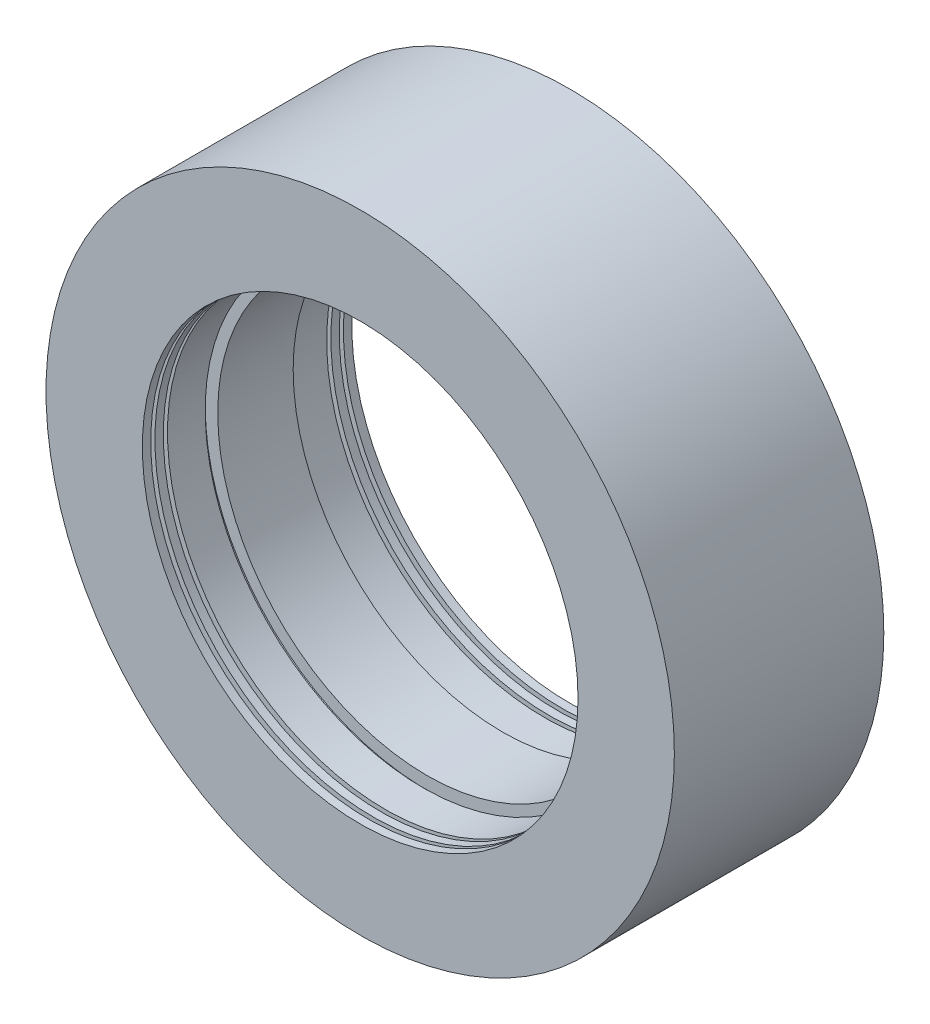
ISO-10303-21;
HEADER;
FILE_DESCRIPTION(('STEP AP214'),'2;1');
FILE_NAME('part.step','',(''),(''),'','','');
FILE_SCHEMA(('AUTOMOTIVE_DESIGN { 1 0 10303 214 1 1 1 1 }'));
ENDSEC;
DATA;
#1=APPLICATION_CONTEXT('core data for automotive mechanical design processes');
#2=APPLICATION_PROTOCOL_DEFINITION('international standard','automotive_design',2000,#1);
#3=PRODUCT_CONTEXT('',#1,'mechanical');
#4=PRODUCT('Part','Part','',(#3));
#5=PRODUCT_RELATED_PRODUCT_CATEGORY('part','',(#4));
#6=PRODUCT_DEFINITION_FORMATION('','',#4);
#7=PRODUCT_DEFINITION_CONTEXT('part definition',#1,'design');
#8=PRODUCT_DEFINITION('design','',#6,#7);
#9=PRODUCT_DEFINITION_SHAPE('','',#8);
#10=(LENGTH_UNIT() NAMED_UNIT(*) SI_UNIT(.MILLI.,.METRE.));
#11=(NAMED_UNIT(*) PLANE_ANGLE_UNIT() SI_UNIT($,.RADIAN.));
#12=(NAMED_UNIT(*) SI_UNIT($,.STERADIAN.) SOLID_ANGLE_UNIT());
#13=UNCERTAINTY_MEASURE_WITH_UNIT(LENGTH_MEASURE(1.E-05),#10,'distance_accuracy_value','');
#14=(GEOMETRIC_REPRESENTATION_CONTEXT(3) GLOBAL_UNCERTAINTY_ASSIGNED_CONTEXT((#13)) GLOBAL_UNIT_ASSIGNED_CONTEXT((#10,
#11,#12)) REPRESENTATION_CONTEXT('',''));
#15=CARTESIAN_POINT('',(0.,0.,0.));
#16=DIRECTION('',(0.,0.,1.));
#17=DIRECTION('',(1.,0.,0.));
#18=AXIS2_PLACEMENT_3D('',#15,#16,#17);
#19=CARTESIAN_POINT('',(0.,73.5029097812287,142.749573326558));
#20=DIRECTION('',(0.,0.,-1.));
#21=DIRECTION('',(-1.,0.,0.));
#22=AXIS2_PLACEMENT_3D('',#19,#20,#21);
#23=PLANE('',#22);
#24=CARTESIAN_POINT('',(0.,-1.49709021877135,142.749573326558));
#25=DIRECTION('',(0.,0.,1.));
#26=DIRECTION('',(1.,0.,0.));
#27=AXIS2_PLACEMENT_3D('',#24,#25,#26);
#28=CIRCLE('',#27,52.);
#29=CARTESIAN_POINT('',(52.,-1.49709021877135,142.749573326558));
#30=VERTEX_POINT('',#29);
#31=EDGE_CURVE('E10',#30,#30,#28,.T.);
#32=ORIENTED_EDGE('',*,*,#31,.F.);
#33=EDGE_LOOP('',(#32));
#34=FACE_BOUND('',#33,.T.);
#35=CARTESIAN_POINT('',(0.,-1.49709021877135,142.749573326558));
#36=DIRECTION('',(0.,0.,1.));
#37=DIRECTION('',(1.,0.,0.));
#38=AXIS2_PLACEMENT_3D('',#35,#36,#37);
#39=CIRCLE('',#38,75.);
#40=CARTESIAN_POINT('',(75.,-1.49709021877135,142.749573326558));
#41=VERTEX_POINT('',#40);
#42=EDGE_CURVE('E122',#41,#41,#39,.T.);
#43=ORIENTED_EDGE('',*,*,#42,.T.);
#44=EDGE_LOOP('',(#43));
#45=FACE_BOUND('',#44,.T.);
#46=ADVANCED_FACE('F34',(#34,#45),#23,.F.);
#47=CARTESIAN_POINT('',(0.,-1.49709021877135,168.1921531317));
#48=DIRECTION('',(0.,0.,1.));
#49=DIRECTION('',(1.,0.,0.));
#50=AXIS2_PLACEMENT_3D('',#47,#48,#49);
#51=CYLINDRICAL_SURFACE('',#50,52.);
#52=CARTESIAN_POINT('',(0.,-1.49709021877135,140.749573326558));
#53=DIRECTION('',(0.,0.,1.));
#54=DIRECTION('',(1.,0.,0.));
#55=AXIS2_PLACEMENT_3D('',#52,#53,#54);
#56=CIRCLE('',#55,52.);
#57=CARTESIAN_POINT('',(52.,-1.49709021877135,140.749573326558));
#58=VERTEX_POINT('',#57);
#59=EDGE_CURVE('E40',#58,#58,#56,.T.);
#60=ORIENTED_EDGE('',*,*,#59,.F.);
#61=EDGE_LOOP('',(#60));
#62=FACE_BOUND('',#61,.T.);
#63=ORIENTED_EDGE('',*,*,#31,.T.);
#64=EDGE_LOOP('',(#63));
#65=FACE_BOUND('',#64,.T.);
#66=ADVANCED_FACE('F279',(#62,#65),#51,.F.);
#67=CARTESIAN_POINT('',(0.,50.5029097812287,140.749573326558));
#68=DIRECTION('',(0.,0.,1.));
#69=DIRECTION('',(1.,0.,0.));
#70=AXIS2_PLACEMENT_3D('',#67,#68,#69);
#71=PLANE('',#70);
#72=CARTESIAN_POINT('',(0.,-1.49709021877135,140.749573326558));
#73=DIRECTION('',(0.,0.,1.));
#74=DIRECTION('',(1.,0.,0.));
#75=AXIS2_PLACEMENT_3D('',#72,#73,#74);
#76=CIRCLE('',#75,54.);
#77=CARTESIAN_POINT('',(54.,-1.49709021877135,140.749573326558));
#78=VERTEX_POINT('',#77);
#79=EDGE_CURVE('E44',#78,#78,#76,.T.);
#80=ORIENTED_EDGE('',*,*,#79,.F.);
#81=EDGE_LOOP('',(#80));
#82=FACE_BOUND('',#81,.T.);
#83=ORIENTED_EDGE('',*,*,#59,.T.);
#84=EDGE_LOOP('',(#83));
#85=FACE_BOUND('',#84,.T.);
#86=ADVANCED_FACE('F274',(#82,#85),#71,.F.);
#87=CARTESIAN_POINT('',(0.,-1.49709021877135,168.1921531317));
#88=DIRECTION('',(0.,0.,1.));
#89=DIRECTION('',(1.,0.,0.));
#90=AXIS2_PLACEMENT_3D('',#87,#88,#89);
#91=CYLINDRICAL_SURFACE('',#90,54.);
#92=CARTESIAN_POINT('',(0.,-1.49709021877135,139.749573326558));
#93=DIRECTION('',(0.,0.,1.));
#94=DIRECTION('',(1.,0.,0.));
#95=AXIS2_PLACEMENT_3D('',#92,#93,#94);
#96=CIRCLE('',#95,54.);
#97=CARTESIAN_POINT('',(54.,-1.49709021877135,139.749573326558));
#98=VERTEX_POINT('',#97);
#99=EDGE_CURVE('E48',#98,#98,#96,.T.);
#100=ORIENTED_EDGE('',*,*,#99,.F.);
#101=EDGE_LOOP('',(#100));
#102=FACE_BOUND('',#101,.T.);
#103=ORIENTED_EDGE('',*,*,#79,.T.);
#104=EDGE_LOOP('',(#103));
#105=FACE_BOUND('',#104,.T.);
#106=ADVANCED_FACE('F268',(#102,#105),#91,.F.);
#107=CARTESIAN_POINT('',(0.,52.5029097812287,139.749573326558));
#108=DIRECTION('',(0.,0.,-1.));
#109=DIRECTION('',(-1.,0.,0.));
#110=AXIS2_PLACEMENT_3D('',#107,#108,#109);
#111=PLANE('',#110);
#112=CARTESIAN_POINT('',(0.,-1.49709021877135,139.749573326558));
#113=DIRECTION('',(0.,0.,1.));
#114=DIRECTION('',(1.,0.,0.));
#115=AXIS2_PLACEMENT_3D('',#112,#113,#114);
#116=CIRCLE('',#115,52.);
#117=CARTESIAN_POINT('',(52.,-1.49709021877135,139.749573326558));
#118=VERTEX_POINT('',#117);
#119=EDGE_CURVE('E53',#118,#118,#116,.T.);
#120=ORIENTED_EDGE('',*,*,#119,.F.);
#121=EDGE_LOOP('',(#120));
#122=FACE_BOUND('',#121,.T.);
#123=ORIENTED_EDGE('',*,*,#99,.T.);
#124=EDGE_LOOP('',(#123));
#125=FACE_BOUND('',#124,.T.);
#126=ADVANCED_FACE('F262',(#122,#125),#111,.F.);
#127=CARTESIAN_POINT('',(0.,-1.49709021877135,168.1921531317));
#128=DIRECTION('',(0.,0.,1.));
#129=DIRECTION('',(1.,0.,0.));
#130=AXIS2_PLACEMENT_3D('',#127,#128,#129);
#131=CYLINDRICAL_SURFACE('',#130,52.);
#132=CARTESIAN_POINT('',(0.,-1.49709021877135,137.749573326558));
#133=DIRECTION('',(0.,0.,1.));
#134=DIRECTION('',(1.,0.,0.));
#135=AXIS2_PLACEMENT_3D('',#132,#133,#134);
#136=CIRCLE('',#135,52.);
#137=CARTESIAN_POINT('',(52.,-1.49709021877135,137.749573326558));
#138=VERTEX_POINT('',#137);
#139=EDGE_CURVE('E56',#138,#138,#136,.T.);
#140=ORIENTED_EDGE('',*,*,#139,.F.);
#141=EDGE_LOOP('',(#140));
#142=FACE_BOUND('',#141,.T.);
#143=ORIENTED_EDGE('',*,*,#119,.T.);
#144=EDGE_LOOP('',(#143));
#145=FACE_BOUND('',#144,.T.);
#146=ADVANCED_FACE('F256',(#142,#145),#131,.F.);
#147=CARTESIAN_POINT('',(0.,50.5029097812287,137.749573326558));
#148=DIRECTION('',(0.,0.,1.));
#149=DIRECTION('',(1.,0.,0.));
#150=AXIS2_PLACEMENT_3D('',#147,#148,#149);
#151=PLANE('',#150);
#152=CARTESIAN_POINT('',(0.,-1.49709021877135,137.749573326558));
#153=DIRECTION('',(0.,0.,1.));
#154=DIRECTION('',(1.,0.,0.));
#155=AXIS2_PLACEMENT_3D('',#152,#153,#154);
#156=CIRCLE('',#155,54.);
#157=CARTESIAN_POINT('',(54.,-1.49709021877135,137.749573326558));
#158=VERTEX_POINT('',#157);
#159=EDGE_CURVE('E59',#158,#158,#156,.T.);
#160=ORIENTED_EDGE('',*,*,#159,.F.);
#161=EDGE_LOOP('',(#160));
#162=FACE_BOUND('',#161,.T.);
#163=ORIENTED_EDGE('',*,*,#139,.T.);
#164=EDGE_LOOP('',(#163));
#165=FACE_BOUND('',#164,.T.);
#166=ADVANCED_FACE('F250',(#162,#165),#151,.F.);
#167=CARTESIAN_POINT('',(0.,-1.49709021877135,168.1921531317));
#168=DIRECTION('',(0.,0.,1.));
#169=DIRECTION('',(1.,0.,0.));
#170=AXIS2_PLACEMENT_3D('',#167,#168,#169);
#171=CYLINDRICAL_SURFACE('',#170,54.);
#172=CARTESIAN_POINT('',(0.,-1.49709021877135,136.749573326558));
#173=DIRECTION('',(0.,0.,1.));
#174=DIRECTION('',(1.,0.,0.));
#175=AXIS2_PLACEMENT_3D('',#172,#173,#174);
#176=CIRCLE('',#175,54.);
#177=CARTESIAN_POINT('',(54.,-1.49709021877135,136.749573326558));
#178=VERTEX_POINT('',#177);
#179=EDGE_CURVE('E62',#178,#178,#176,.T.);
#180=ORIENTED_EDGE('',*,*,#179,.F.);
#181=EDGE_LOOP('',(#180));
#182=FACE_BOUND('',#181,.T.);
#183=ORIENTED_EDGE('',*,*,#159,.T.);
#184=EDGE_LOOP('',(#183));
#185=FACE_BOUND('',#184,.T.);
#186=ADVANCED_FACE('F244',(#182,#185),#171,.F.);
#187=CARTESIAN_POINT('',(0.,52.5029097812287,136.749573326558));
#188=DIRECTION('',(0.,0.,-1.));
#189=DIRECTION('',(-1.,0.,0.));
#190=AXIS2_PLACEMENT_3D('',#187,#188,#189);
#191=PLANE('',#190);
#192=CARTESIAN_POINT('',(0.,-1.49709021877135,136.749573326558));
#193=DIRECTION('',(0.,0.,1.));
#194=DIRECTION('',(1.,0.,0.));
#195=AXIS2_PLACEMENT_3D('',#192,#193,#194);
#196=CIRCLE('',#195,52.);
#197=CARTESIAN_POINT('',(52.,-1.49709021877135,136.749573326558));
#198=VERTEX_POINT('',#197);
#199=EDGE_CURVE('E65',#198,#198,#196,.T.);
#200=ORIENTED_EDGE('',*,*,#199,.F.);
#201=EDGE_LOOP('',(#200));
#202=FACE_BOUND('',#201,.T.);
#203=ORIENTED_EDGE('',*,*,#179,.T.);
#204=EDGE_LOOP('',(#203));
#205=FACE_BOUND('',#204,.T.);
#206=ADVANCED_FACE('F238',(#202,#205),#191,.F.);
#207=CARTESIAN_POINT('',(0.,-1.49709021877135,168.1921531317));
#208=DIRECTION('',(0.,0.,1.));
#209=DIRECTION('',(1.,0.,0.));
#210=AXIS2_PLACEMENT_3D('',#207,#208,#209);
#211=CYLINDRICAL_SURFACE('',#210,52.);
#212=CARTESIAN_POINT('',(0.,-1.49709021877135,127.749573326558));
#213=DIRECTION('',(0.,0.,1.));
#214=DIRECTION('',(1.,0.,0.));
#215=AXIS2_PLACEMENT_3D('',#212,#213,#214);
#216=CIRCLE('',#215,52.);
#217=CARTESIAN_POINT('',(52.,-1.49709021877135,127.749573326558));
#218=VERTEX_POINT('',#217);
#219=EDGE_CURVE('E68',#218,#218,#216,.T.);
#220=ORIENTED_EDGE('',*,*,#219,.F.);
#221=EDGE_LOOP('',(#220));
#222=FACE_BOUND('',#221,.T.);
#223=ORIENTED_EDGE('',*,*,#199,.T.);
#224=EDGE_LOOP('',(#223));
#225=FACE_BOUND('',#224,.T.);
#226=ADVANCED_FACE('F232',(#222,#225),#211,.F.);
#227=CARTESIAN_POINT('',(0.,50.5029097812287,127.749573326558));
#228=DIRECTION('',(0.,0.,1.));
#229=DIRECTION('',(1.,0.,0.));
#230=AXIS2_PLACEMENT_3D('',#227,#228,#229);
#231=PLANE('',#230);
#232=CARTESIAN_POINT('',(0.,-1.49709021877135,127.749573326558));
#233=DIRECTION('',(0.,0.,1.));
#234=DIRECTION('',(1.,0.,0.));
#235=AXIS2_PLACEMENT_3D('',#232,#233,#234);
#236=CIRCLE('',#235,53.);
#237=CARTESIAN_POINT('',(53.,-1.49709021877135,127.749573326558));
#238=VERTEX_POINT('',#237);
#239=EDGE_CURVE('E71',#238,#238,#236,.T.);
#240=ORIENTED_EDGE('',*,*,#239,.F.);
#241=EDGE_LOOP('',(#240));
#242=FACE_BOUND('',#241,.T.);
#243=ORIENTED_EDGE('',*,*,#219,.T.);
#244=EDGE_LOOP('',(#243));
#245=FACE_BOUND('',#244,.T.);
#246=ADVANCED_FACE('F226',(#242,#245),#231,.F.);
#247=CARTESIAN_POINT('',(0.,-1.49709021877135,168.1921531317));
#248=DIRECTION('',(0.,0.,1.));
#249=DIRECTION('',(1.,0.,0.));
#250=AXIS2_PLACEMENT_3D('',#247,#248,#249);
#251=CYLINDRICAL_SURFACE('',#250,53.);
#252=CARTESIAN_POINT('',(0.,-1.49709021877135,126.749573326558));
#253=DIRECTION('',(0.,0.,1.));
#254=DIRECTION('',(1.,0.,0.));
#255=AXIS2_PLACEMENT_3D('',#252,#253,#254);
#256=CIRCLE('',#255,53.);
#257=CARTESIAN_POINT('',(53.,-1.49709021877135,126.749573326558));
#258=VERTEX_POINT('',#257);
#259=EDGE_CURVE('E74',#258,#258,#256,.T.);
#260=ORIENTED_EDGE('',*,*,#259,.F.);
#261=EDGE_LOOP('',(#260));
#262=FACE_BOUND('',#261,.T.);
#263=ORIENTED_EDGE('',*,*,#239,.T.);
#264=EDGE_LOOP('',(#263));
#265=FACE_BOUND('',#264,.T.);
#266=ADVANCED_FACE('F220',(#262,#265),#251,.F.);
#267=CARTESIAN_POINT('',(0.,51.5029097812287,126.749573326558));
#268=DIRECTION('',(0.,0.,-1.));
#269=DIRECTION('',(-1.,0.,0.));
#270=AXIS2_PLACEMENT_3D('',#267,#268,#269);
#271=PLANE('',#270);
#272=CARTESIAN_POINT('',(0.,-1.49709021877135,126.749573326558));
#273=DIRECTION('',(0.,0.,1.));
#274=DIRECTION('',(1.,0.,0.));
#275=AXIS2_PLACEMENT_3D('',#272,#273,#274);
#276=CIRCLE('',#275,50.);
#277=CARTESIAN_POINT('',(50.,-1.49709021877135,126.749573326558));
#278=VERTEX_POINT('',#277);
#279=EDGE_CURVE('E77',#278,#278,#276,.T.);
#280=ORIENTED_EDGE('',*,*,#279,.F.);
#281=EDGE_LOOP('',(#280));
#282=FACE_BOUND('',#281,.T.);
#283=ORIENTED_EDGE('',*,*,#259,.T.);
#284=EDGE_LOOP('',(#283));
#285=FACE_BOUND('',#284,.T.);
#286=ADVANCED_FACE('F214',(#282,#285),#271,.F.);
#287=CARTESIAN_POINT('',(0.,-1.49709021877135,168.1921531317));
#288=DIRECTION('',(0.,0.,1.));
#289=DIRECTION('',(1.,0.,0.));
#290=AXIS2_PLACEMENT_3D('',#287,#288,#289);
#291=CYLINDRICAL_SURFACE('',#290,50.);
#292=CARTESIAN_POINT('',(0.,-1.49709021877135,108.749573326558));
#293=DIRECTION('',(0.,0.,1.));
#294=DIRECTION('',(1.,0.,0.));
#295=AXIS2_PLACEMENT_3D('',#292,#293,#294);
#296=CIRCLE('',#295,50.);
#297=CARTESIAN_POINT('',(50.,-1.49709021877135,108.749573326558));
#298=VERTEX_POINT('',#297);
#299=EDGE_CURVE('E80',#298,#298,#296,.T.);
#300=ORIENTED_EDGE('',*,*,#299,.F.);
#301=EDGE_LOOP('',(#300));
#302=FACE_BOUND('',#301,.T.);
#303=ORIENTED_EDGE('',*,*,#279,.T.);
#304=EDGE_LOOP('',(#303));
#305=FACE_BOUND('',#304,.T.);
#306=ADVANCED_FACE('F208',(#302,#305),#291,.F.);
#307=CARTESIAN_POINT('',(0.,51.5029097812287,108.749573326558));
#308=DIRECTION('',(0.,0.,1.));
#309=DIRECTION('',(1.,0.,0.));
#310=AXIS2_PLACEMENT_3D('',#307,#308,#309);
#311=PLANE('',#310);
#312=CARTESIAN_POINT('',(0.,-1.49709021877135,108.749573326558));
#313=DIRECTION('',(0.,0.,1.));
#314=DIRECTION('',(1.,0.,0.));
#315=AXIS2_PLACEMENT_3D('',#312,#313,#314);
#316=CIRCLE('',#315,53.);
#317=CARTESIAN_POINT('',(53.,-1.49709021877135,108.749573326558));
#318=VERTEX_POINT('',#317);
#319=EDGE_CURVE('E83',#318,#318,#316,.T.);
#320=ORIENTED_EDGE('',*,*,#319,.F.);
#321=EDGE_LOOP('',(#320));
#322=FACE_BOUND('',#321,.T.);
#323=ORIENTED_EDGE('',*,*,#299,.T.);
#324=EDGE_LOOP('',(#323));
#325=FACE_BOUND('',#324,.T.);
#326=ADVANCED_FACE('F202',(#322,#325),#311,.F.);
#327=CARTESIAN_POINT('',(0.,-1.49709021877135,168.1921531317));
#328=DIRECTION('',(0.,0.,1.));
#329=DIRECTION('',(1.,0.,0.));
#330=AXIS2_PLACEMENT_3D('',#327,#328,#329);
#331=CYLINDRICAL_SURFACE('',#330,53.);
#332=CARTESIAN_POINT('',(0.,-1.49709021877135,107.749573326558));
#333=DIRECTION('',(0.,0.,1.));
#334=DIRECTION('',(1.,0.,0.));
#335=AXIS2_PLACEMENT_3D('',#332,#333,#334);
#336=CIRCLE('',#335,53.);
#337=CARTESIAN_POINT('',(53.,-1.49709021877135,107.749573326558));
#338=VERTEX_POINT('',#337);
#339=EDGE_CURVE('E86',#338,#338,#336,.T.);
#340=ORIENTED_EDGE('',*,*,#339,.F.);
#341=EDGE_LOOP('',(#340));
#342=FACE_BOUND('',#341,.T.);
#343=ORIENTED_EDGE('',*,*,#319,.T.);
#344=EDGE_LOOP('',(#343));
#345=FACE_BOUND('',#344,.T.);
#346=ADVANCED_FACE('F196',(#342,#345),#331,.F.);
#347=CARTESIAN_POINT('',(0.,50.5029097812287,107.749573326558));
#348=DIRECTION('',(0.,0.,-1.));
#349=DIRECTION('',(-1.,0.,0.));
#350=AXIS2_PLACEMENT_3D('',#347,#348,#349);
#351=PLANE('',#350);
#352=CARTESIAN_POINT('',(0.,-1.49709021877135,107.749573326558));
#353=DIRECTION('',(0.,0.,1.));
#354=DIRECTION('',(1.,0.,0.));
#355=AXIS2_PLACEMENT_3D('',#352,#353,#354);
#356=CIRCLE('',#355,52.);
#357=CARTESIAN_POINT('',(52.,-1.49709021877135,107.749573326558));
#358=VERTEX_POINT('',#357);
#359=EDGE_CURVE('E89',#358,#358,#356,.T.);
#360=ORIENTED_EDGE('',*,*,#359,.F.);
#361=EDGE_LOOP('',(#360));
#362=FACE_BOUND('',#361,.T.);
#363=ORIENTED_EDGE('',*,*,#339,.T.);
#364=EDGE_LOOP('',(#363));
#365=FACE_BOUND('',#364,.T.);
#366=ADVANCED_FACE('F190',(#362,#365),#351,.F.);
#367=CARTESIAN_POINT('',(0.,-1.49709021877135,168.1921531317));
#368=DIRECTION('',(0.,0.,1.));
#369=DIRECTION('',(1.,0.,0.));
#370=AXIS2_PLACEMENT_3D('',#367,#368,#369);
#371=CYLINDRICAL_SURFACE('',#370,52.);
#372=CARTESIAN_POINT('',(0.,-1.49709021877135,98.7495733265583));
#373=DIRECTION('',(0.,0.,1.));
#374=DIRECTION('',(1.,0.,0.));
#375=AXIS2_PLACEMENT_3D('',#372,#373,#374);
#376=CIRCLE('',#375,52.);
#377=CARTESIAN_POINT('',(52.,-1.49709021877135,98.7495733265583));
#378=VERTEX_POINT('',#377);
#379=EDGE_CURVE('E92',#378,#378,#376,.T.);
#380=ORIENTED_EDGE('',*,*,#379,.F.);
#381=EDGE_LOOP('',(#380));
#382=FACE_BOUND('',#381,.T.);
#383=ORIENTED_EDGE('',*,*,#359,.T.);
#384=EDGE_LOOP('',(#383));
#385=FACE_BOUND('',#384,.T.);
#386=ADVANCED_FACE('F184',(#382,#385),#371,.F.);
#387=CARTESIAN_POINT('',(0.,52.5029097812287,98.7495733265583));
#388=DIRECTION('',(0.,0.,1.));
#389=DIRECTION('',(1.,0.,0.));
#390=AXIS2_PLACEMENT_3D('',#387,#388,#389);
#391=PLANE('',#390);
#392=CARTESIAN_POINT('',(0.,-1.49709021877135,98.7495733265583));
#393=DIRECTION('',(0.,0.,1.));
#394=DIRECTION('',(1.,0.,0.));
#395=AXIS2_PLACEMENT_3D('',#392,#393,#394);
#396=CIRCLE('',#395,54.);
#397=CARTESIAN_POINT('',(54.,-1.49709021877135,98.7495733265583));
#398=VERTEX_POINT('',#397);
#399=EDGE_CURVE('E95',#398,#398,#396,.T.);
#400=ORIENTED_EDGE('',*,*,#399,.F.);
#401=EDGE_LOOP('',(#400));
#402=FACE_BOUND('',#401,.T.);
#403=ORIENTED_EDGE('',*,*,#379,.T.);
#404=EDGE_LOOP('',(#403));
#405=FACE_BOUND('',#404,.T.);
#406=ADVANCED_FACE('F178',(#402,#405),#391,.F.);
#407=CARTESIAN_POINT('',(0.,-1.49709021877135,168.1921531317));
#408=DIRECTION('',(0.,0.,1.));
#409=DIRECTION('',(1.,0.,0.));
#410=AXIS2_PLACEMENT_3D('',#407,#408,#409);
#411=CYLINDRICAL_SURFACE('',#410,54.);
#412=CARTESIAN_POINT('',(0.,-1.49709021877135,97.7495733265583));
#413=DIRECTION('',(0.,0.,1.));
#414=DIRECTION('',(1.,0.,0.));
#415=AXIS2_PLACEMENT_3D('',#412,#413,#414);
#416=CIRCLE('',#415,54.);
#417=CARTESIAN_POINT('',(54.,-1.49709021877135,97.7495733265583));
#418=VERTEX_POINT('',#417);
#419=EDGE_CURVE('E98',#418,#418,#416,.T.);
#420=ORIENTED_EDGE('',*,*,#419,.F.);
#421=EDGE_LOOP('',(#420));
#422=FACE_BOUND('',#421,.T.);
#423=ORIENTED_EDGE('',*,*,#399,.T.);
#424=EDGE_LOOP('',(#423));
#425=FACE_BOUND('',#424,.T.);
#426=ADVANCED_FACE('F172',(#422,#425),#411,.F.);
#427=CARTESIAN_POINT('',(0.,50.5029097812287,97.7495733265583));
#428=DIRECTION('',(0.,0.,-1.));
#429=DIRECTION('',(-1.,0.,0.));
#430=AXIS2_PLACEMENT_3D('',#427,#428,#429);
#431=PLANE('',#430);
#432=CARTESIAN_POINT('',(0.,-1.49709021877135,97.7495733265583));
#433=DIRECTION('',(0.,0.,1.));
#434=DIRECTION('',(1.,0.,0.));
#435=AXIS2_PLACEMENT_3D('',#432,#433,#434);
#436=CIRCLE('',#435,52.);
#437=CARTESIAN_POINT('',(52.,-1.49709021877135,97.7495733265583));
#438=VERTEX_POINT('',#437);
#439=EDGE_CURVE('E101',#438,#438,#436,.T.);
#440=ORIENTED_EDGE('',*,*,#439,.F.);
#441=EDGE_LOOP('',(#440));
#442=FACE_BOUND('',#441,.T.);
#443=ORIENTED_EDGE('',*,*,#419,.T.);
#444=EDGE_LOOP('',(#443));
#445=FACE_BOUND('',#444,.T.);
#446=ADVANCED_FACE('F166',(#442,#445),#431,.F.);
#447=CARTESIAN_POINT('',(0.,-1.49709021877135,168.1921531317));
#448=DIRECTION('',(0.,0.,1.));
#449=DIRECTION('',(1.,0.,0.));
#450=AXIS2_PLACEMENT_3D('',#447,#448,#449);
#451=CYLINDRICAL_SURFACE('',#450,52.);
#452=CARTESIAN_POINT('',(0.,-1.49709021877135,95.7495733265583));
#453=DIRECTION('',(0.,0.,1.));
#454=DIRECTION('',(1.,0.,0.));
#455=AXIS2_PLACEMENT_3D('',#452,#453,#454);
#456=CIRCLE('',#455,52.);
#457=CARTESIAN_POINT('',(52.,-1.49709021877135,95.7495733265583));
#458=VERTEX_POINT('',#457);
#459=EDGE_CURVE('E104',#458,#458,#456,.T.);
#460=ORIENTED_EDGE('',*,*,#459,.F.);
#461=EDGE_LOOP('',(#460));
#462=FACE_BOUND('',#461,.T.);
#463=ORIENTED_EDGE('',*,*,#439,.T.);
#464=EDGE_LOOP('',(#463));
#465=FACE_BOUND('',#464,.T.);
#466=ADVANCED_FACE('F160',(#462,#465),#451,.F.);
#467=CARTESIAN_POINT('',(0.,52.5029097812287,95.7495733265583));
#468=DIRECTION('',(0.,0.,1.));
#469=DIRECTION('',(1.,0.,0.));
#470=AXIS2_PLACEMENT_3D('',#467,#468,#469);
#471=PLANE('',#470);
#472=CARTESIAN_POINT('',(0.,-1.49709021877135,95.7495733265583));
#473=DIRECTION('',(0.,0.,1.));
#474=DIRECTION('',(1.,0.,0.));
#475=AXIS2_PLACEMENT_3D('',#472,#473,#474);
#476=CIRCLE('',#475,54.);
#477=CARTESIAN_POINT('',(54.,-1.49709021877135,95.7495733265583));
#478=VERTEX_POINT('',#477);
#479=EDGE_CURVE('E107',#478,#478,#476,.T.);
#480=ORIENTED_EDGE('',*,*,#479,.F.);
#481=EDGE_LOOP('',(#480));
#482=FACE_BOUND('',#481,.T.);
#483=ORIENTED_EDGE('',*,*,#459,.T.);
#484=EDGE_LOOP('',(#483));
#485=FACE_BOUND('',#484,.T.);
#486=ADVANCED_FACE('F154',(#482,#485),#471,.F.);
#487=CARTESIAN_POINT('',(0.,-1.49709021877135,168.1921531317));
#488=DIRECTION('',(0.,0.,1.));
#489=DIRECTION('',(1.,0.,0.));
#490=AXIS2_PLACEMENT_3D('',#487,#488,#489);
#491=CYLINDRICAL_SURFACE('',#490,54.);
#492=CARTESIAN_POINT('',(0.,-1.49709021877135,94.7495733265583));
#493=DIRECTION('',(0.,0.,1.));
#494=DIRECTION('',(1.,0.,0.));
#495=AXIS2_PLACEMENT_3D('',#492,#493,#494);
#496=CIRCLE('',#495,54.);
#497=CARTESIAN_POINT('',(54.,-1.49709021877135,94.7495733265583));
#498=VERTEX_POINT('',#497);
#499=EDGE_CURVE('E110',#498,#498,#496,.T.);
#500=ORIENTED_EDGE('',*,*,#499,.F.);
#501=EDGE_LOOP('',(#500));
#502=FACE_BOUND('',#501,.T.);
#503=ORIENTED_EDGE('',*,*,#479,.T.);
#504=EDGE_LOOP('',(#503));
#505=FACE_BOUND('',#504,.T.);
#506=ADVANCED_FACE('F148',(#502,#505),#491,.F.);
#507=CARTESIAN_POINT('',(0.,50.5029097812287,94.7495733265583));
#508=DIRECTION('',(0.,0.,-1.));
#509=DIRECTION('',(-1.,0.,0.));
#510=AXIS2_PLACEMENT_3D('',#507,#508,#509);
#511=PLANE('',#510);
#512=CARTESIAN_POINT('',(0.,-1.49709021877135,94.7495733265583));
#513=DIRECTION('',(0.,0.,1.));
#514=DIRECTION('',(1.,0.,0.));
#515=AXIS2_PLACEMENT_3D('',#512,#513,#514);
#516=CIRCLE('',#515,52.);
#517=CARTESIAN_POINT('',(52.,-1.49709021877135,94.7495733265583));
#518=VERTEX_POINT('',#517);
#519=EDGE_CURVE('E113',#518,#518,#516,.T.);
#520=ORIENTED_EDGE('',*,*,#519,.F.);
#521=EDGE_LOOP('',(#520));
#522=FACE_BOUND('',#521,.T.);
#523=ORIENTED_EDGE('',*,*,#499,.T.);
#524=EDGE_LOOP('',(#523));
#525=FACE_BOUND('',#524,.T.);
#526=ADVANCED_FACE('F142',(#522,#525),#511,.F.);
#527=CARTESIAN_POINT('',(0.,-1.49709021877135,168.1921531317));
#528=DIRECTION('',(0.,0.,1.));
#529=DIRECTION('',(1.,0.,0.));
#530=AXIS2_PLACEMENT_3D('',#527,#528,#529);
#531=CYLINDRICAL_SURFACE('',#530,52.);
#532=CARTESIAN_POINT('',(0.,-1.49709021877135,92.7495733265583));
#533=DIRECTION('',(0.,0.,1.));
#534=DIRECTION('',(1.,0.,0.));
#535=AXIS2_PLACEMENT_3D('',#532,#533,#534);
#536=CIRCLE('',#535,52.);
#537=CARTESIAN_POINT('',(52.,-1.49709021877135,92.7495733265583));
#538=VERTEX_POINT('',#537);
#539=EDGE_CURVE('E116',#538,#538,#536,.T.);
#540=ORIENTED_EDGE('',*,*,#539,.F.);
#541=EDGE_LOOP('',(#540));
#542=FACE_BOUND('',#541,.T.);
#543=ORIENTED_EDGE('',*,*,#519,.T.);
#544=EDGE_LOOP('',(#543));
#545=FACE_BOUND('',#544,.T.);
#546=ADVANCED_FACE('F136',(#542,#545),#531,.F.);
#547=CARTESIAN_POINT('',(0.,73.5029097812287,92.7495733265583));
#548=DIRECTION('',(0.,0.,1.));
#549=DIRECTION('',(1.,0.,0.));
#550=AXIS2_PLACEMENT_3D('',#547,#548,#549);
#551=PLANE('',#550);
#552=CARTESIAN_POINT('',(0.,-1.49709021877135,92.7495733265583));
#553=DIRECTION('',(0.,0.,1.));
#554=DIRECTION('',(1.,0.,0.));
#555=AXIS2_PLACEMENT_3D('',#552,#553,#554);
#556=CIRCLE('',#555,75.);
#557=CARTESIAN_POINT('',(75.,-1.49709021877135,92.7495733265583));
#558=VERTEX_POINT('',#557);
#559=EDGE_CURVE('E119',#558,#558,#556,.T.);
#560=ORIENTED_EDGE('',*,*,#559,.F.);
#561=EDGE_LOOP('',(#560));
#562=FACE_BOUND('',#561,.T.);
#563=ORIENTED_EDGE('',*,*,#539,.T.);
#564=EDGE_LOOP('',(#563));
#565=FACE_BOUND('',#564,.T.);
#566=ADVANCED_FACE('F130',(#562,#565),#551,.F.);
#567=CARTESIAN_POINT('',(0.,-1.49709021877135,168.1921531317));
#568=DIRECTION('',(0.,0.,1.));
#569=DIRECTION('',(1.,0.,0.));
#570=AXIS2_PLACEMENT_3D('',#567,#568,#569);
#571=CYLINDRICAL_SURFACE('',#570,75.);
#572=ORIENTED_EDGE('',*,*,#42,.F.);
#573=EDGE_LOOP('',(#572));
#574=FACE_BOUND('',#573,.T.);
#575=ORIENTED_EDGE('',*,*,#559,.T.);
#576=EDGE_LOOP('',(#575));
#577=FACE_BOUND('',#576,.T.);
#578=ADVANCED_FACE('F127',(#574,#577),#571,.T.);
#579=CLOSED_SHELL('',(#46,#66,#86,#106,#126,#146,#166,#186,#206,#226,#246,#266,#286,#306,#326,
#346,#366,#386,#406,#426,#446,#466,#486,#506,#526,#546,#566,#578));
#580=MANIFOLD_SOLID_BREP('B2',#579);
#581=ADVANCED_BREP_SHAPE_REPRESENTATION('',(#18,#580),#14);
#582=SHAPE_DEFINITION_REPRESENTATION(#9,#581);
ENDSEC;
END-ISO-10303-21;
